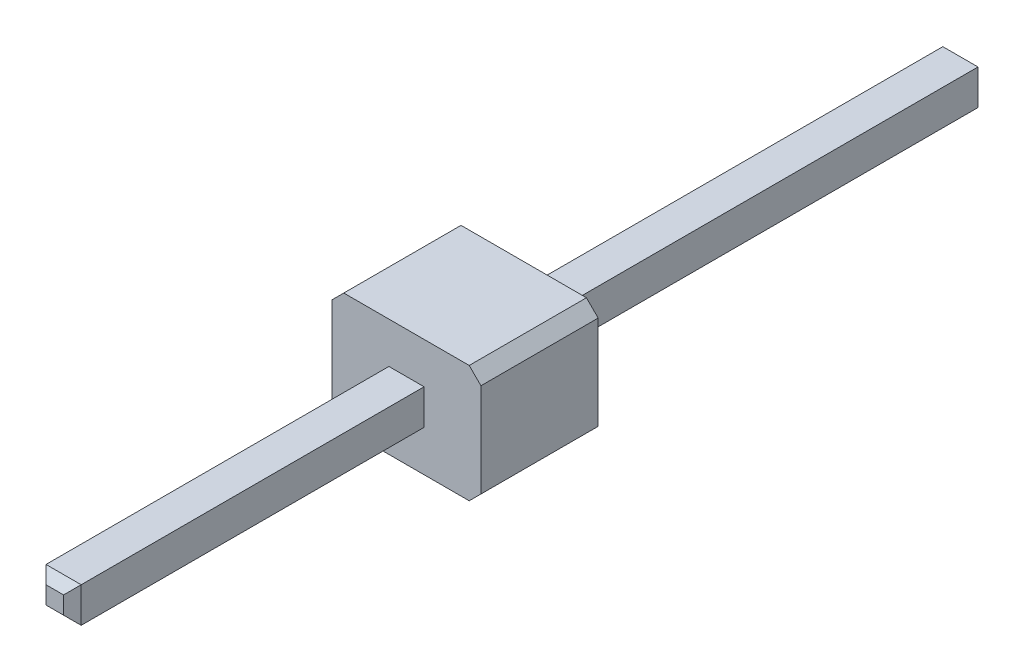
ISO-10303-21;
HEADER;
FILE_DESCRIPTION(('STEP AP214'),'2;1');
FILE_NAME('part.step','',(''),(''),'','','');
FILE_SCHEMA(('AUTOMOTIVE_DESIGN { 1 0 10303 214 1 1 1 1 }'));
ENDSEC;
DATA;
#1=APPLICATION_CONTEXT('core data for automotive mechanical design processes');
#2=APPLICATION_PROTOCOL_DEFINITION('international standard','automotive_design',2000,#1);
#3=PRODUCT_CONTEXT('',#1,'mechanical');
#4=PRODUCT('Part','Part','',(#3));
#5=PRODUCT_RELATED_PRODUCT_CATEGORY('part','',(#4));
#6=PRODUCT_DEFINITION_FORMATION('','',#4);
#7=PRODUCT_DEFINITION_CONTEXT('part definition',#1,'design');
#8=PRODUCT_DEFINITION('design','',#6,#7);
#9=PRODUCT_DEFINITION_SHAPE('','',#8);
#10=(LENGTH_UNIT() NAMED_UNIT(*) SI_UNIT(.MILLI.,.METRE.));
#11=(NAMED_UNIT(*) PLANE_ANGLE_UNIT() SI_UNIT($,.RADIAN.));
#12=(NAMED_UNIT(*) SI_UNIT($,.STERADIAN.) SOLID_ANGLE_UNIT());
#13=UNCERTAINTY_MEASURE_WITH_UNIT(LENGTH_MEASURE(1.E-05),#10,'distance_accuracy_value','');
#14=(GEOMETRIC_REPRESENTATION_CONTEXT(3) GLOBAL_UNCERTAINTY_ASSIGNED_CONTEXT((#13)) GLOBAL_UNIT_ASSIGNED_CONTEXT((#10,
#11,#12)) REPRESENTATION_CONTEXT('',''));
#15=CARTESIAN_POINT('',(0.,0.,0.));
#16=DIRECTION('',(0.,0.,1.));
#17=DIRECTION('',(1.,0.,0.));
#18=AXIS2_PLACEMENT_3D('',#15,#16,#17);
#19=CARTESIAN_POINT('',(-0.15,-0.15,-4.8));
#20=DIRECTION('',(0.,0.,-1.));
#21=DIRECTION('',(1.,0.,0.));
#22=AXIS2_PLACEMENT_3D('',#19,#20,#21);
#23=PLANE('',#22);
#24=DIRECTION('',(0.,1.,0.));
#25=VECTOR('',#24,1.);
#26=CARTESIAN_POINT('',(0.075,-0.15,-4.8));
#27=LINE('',#26,#25);
#28=CARTESIAN_POINT('',(0.075,-0.075,-4.8));
#29=VERTEX_POINT('',#28);
#30=CARTESIAN_POINT('',(0.075,0.075,-4.8));
#31=VERTEX_POINT('',#30);
#32=EDGE_CURVE('E450',#29,#31,#27,.T.);
#33=ORIENTED_EDGE('',*,*,#32,.F.);
#34=DIRECTION('',(1.,0.,0.));
#35=VECTOR('',#34,1.);
#36=CARTESIAN_POINT('',(-0.15,-0.075,-4.8));
#37=LINE('',#36,#35);
#38=CARTESIAN_POINT('',(-0.075,-0.075,-4.8));
#39=VERTEX_POINT('',#38);
#40=EDGE_CURVE('E351',#39,#29,#37,.T.);
#41=ORIENTED_EDGE('',*,*,#40,.F.);
#42=DIRECTION('',(0.,1.,0.));
#43=VECTOR('',#42,1.);
#44=CARTESIAN_POINT('',(-0.075,-0.15,-4.8));
#45=LINE('',#44,#43);
#46=CARTESIAN_POINT('',(-0.075,0.075,-4.8));
#47=VERTEX_POINT('',#46);
#48=EDGE_CURVE('E11',#39,#47,#45,.T.);
#49=ORIENTED_EDGE('',*,*,#48,.T.);
#50=DIRECTION('',(1.,0.,0.));
#51=VECTOR('',#50,1.);
#52=CARTESIAN_POINT('',(-0.15,0.075,-4.8));
#53=LINE('',#52,#51);
#54=EDGE_CURVE('E453',#47,#31,#53,.T.);
#55=ORIENTED_EDGE('',*,*,#54,.T.);
#56=EDGE_LOOP('',(#33,#41,#49,#55));
#57=FACE_BOUND('',#56,.T.);
#58=ADVANCED_FACE('F52',(#57),#23,.T.);
#59=CARTESIAN_POINT('',(-0.15,-0.15,3.));
#60=DIRECTION('',(0.,0.,-1.));
#61=DIRECTION('',(1.,0.,0.));
#62=AXIS2_PLACEMENT_3D('',#59,#60,#61);
#63=PLANE('',#62);
#64=DIRECTION('',(0.,1.,0.));
#65=VECTOR('',#64,1.);
#66=CARTESIAN_POINT('',(0.075,-0.15,3.));
#67=LINE('',#66,#65);
#68=CARTESIAN_POINT('',(0.075,-0.075,3.));
#69=VERTEX_POINT('',#68);
#70=CARTESIAN_POINT('',(0.075,0.075,3.));
#71=VERTEX_POINT('',#70);
#72=EDGE_CURVE('E386',#69,#71,#67,.T.);
#73=ORIENTED_EDGE('',*,*,#72,.T.);
#74=DIRECTION('',(1.,0.,0.));
#75=VECTOR('',#74,1.);
#76=CARTESIAN_POINT('',(-0.15,0.075,3.));
#77=LINE('',#76,#75);
#78=CARTESIAN_POINT('',(-0.075,0.075,3.));
#79=VERTEX_POINT('',#78);
#80=EDGE_CURVE('E333',#79,#71,#77,.T.);
#81=ORIENTED_EDGE('',*,*,#80,.F.);
#82=DIRECTION('',(0.,1.,0.));
#83=VECTOR('',#82,1.);
#84=CARTESIAN_POINT('',(-0.075,-0.15,3.));
#85=LINE('',#84,#83);
#86=CARTESIAN_POINT('',(-0.075,-0.075,3.));
#87=VERTEX_POINT('',#86);
#88=EDGE_CURVE('E383',#87,#79,#85,.T.);
#89=ORIENTED_EDGE('',*,*,#88,.F.);
#90=DIRECTION('',(1.,0.,0.));
#91=VECTOR('',#90,1.);
#92=CARTESIAN_POINT('',(-0.15,-0.075,3.));
#93=LINE('',#92,#91);
#94=EDGE_CURVE('E426',#87,#69,#93,.T.);
#95=ORIENTED_EDGE('',*,*,#94,.T.);
#96=EDGE_LOOP('',(#73,#81,#89,#95));
#97=FACE_BOUND('',#96,.T.);
#98=ADVANCED_FACE('F487',(#97),#63,.F.);
#99=CARTESIAN_POINT('',(-0.1125,-0.15,-4.7625));
#100=DIRECTION('',(0.707106781186548,0.,0.707106781186548));
#101=DIRECTION('',(0.,-1.,0.));
#102=AXIS2_PLACEMENT_3D('',#99,#100,#101);
#103=PLANE('',#102);
#104=ORIENTED_EDGE('',*,*,#48,.F.);
#105=DIRECTION('',(0.577350269189626,0.577350269189626,-0.577350269189626));
#106=VECTOR('',#105,1.);
#107=CARTESIAN_POINT('',(-0.125,-0.125,-4.75));
#108=LINE('',#107,#106);
#109=CARTESIAN_POINT('',(-0.15,-0.15,-4.725));
#110=VERTEX_POINT('',#109);
#111=EDGE_CURVE('E432',#110,#39,#108,.T.);
#112=ORIENTED_EDGE('',*,*,#111,.F.);
#113=DIRECTION('',(0.,1.,0.));
#114=VECTOR('',#113,1.);
#115=CARTESIAN_POINT('',(-0.15,-0.15,-4.725));
#116=LINE('',#115,#114);
#117=CARTESIAN_POINT('',(-0.15,0.15,-4.725));
#118=VERTEX_POINT('',#117);
#119=EDGE_CURVE('E390',#110,#118,#116,.T.);
#120=ORIENTED_EDGE('',*,*,#119,.T.);
#121=DIRECTION('',(0.577350269189626,-0.577350269189626,-0.577350269189626));
#122=VECTOR('',#121,1.);
#123=CARTESIAN_POINT('',(-0.075,0.075,-4.8));
#124=LINE('',#123,#122);
#125=EDGE_CURVE('E55',#118,#47,#124,.T.);
#126=ORIENTED_EDGE('',*,*,#125,.T.);
#127=EDGE_LOOP('',(#104,#112,#120,#126));
#128=FACE_BOUND('',#127,.T.);
#129=ADVANCED_FACE('F492',(#128),#103,.F.);
#130=CARTESIAN_POINT('',(-0.15,0.1125,-4.7625));
#131=DIRECTION('',(0.,0.707106781186548,-0.707106781186548));
#132=DIRECTION('',(1.,0.,0.));
#133=AXIS2_PLACEMENT_3D('',#130,#131,#132);
#134=PLANE('',#133);
#135=ORIENTED_EDGE('',*,*,#54,.F.);
#136=ORIENTED_EDGE('',*,*,#125,.F.);
#137=DIRECTION('',(1.,0.,0.));
#138=VECTOR('',#137,1.);
#139=CARTESIAN_POINT('',(-0.15,0.15,-4.725));
#140=LINE('',#139,#138);
#141=CARTESIAN_POINT('',(0.15,0.15,-4.725));
#142=VERTEX_POINT('',#141);
#143=EDGE_CURVE('E387',#118,#142,#140,.T.);
#144=ORIENTED_EDGE('',*,*,#143,.T.);
#145=DIRECTION('',(-0.577350269189626,-0.577350269189626,-0.577350269189626));
#146=VECTOR('',#145,1.);
#147=CARTESIAN_POINT('',(0.025,0.025,-4.85));
#148=LINE('',#147,#146);
#149=EDGE_CURVE('E80',#142,#31,#148,.T.);
#150=ORIENTED_EDGE('',*,*,#149,.T.);
#151=EDGE_LOOP('',(#135,#136,#144,#150));
#152=FACE_BOUND('',#151,.T.);
#153=ADVANCED_FACE('F729',(#152),#134,.T.);
#154=CARTESIAN_POINT('',(0.1125,-0.15,-4.7625));
#155=DIRECTION('',(0.707106781186548,0.,-0.707106781186548));
#156=DIRECTION('',(0.,-1.,0.));
#157=AXIS2_PLACEMENT_3D('',#154,#155,#156);
#158=PLANE('',#157);
#159=DIRECTION('',(-0.577350269189626,0.577350269189626,-0.577350269189626));
#160=VECTOR('',#159,1.);
#161=CARTESIAN_POINT('',(0.075,-0.075,-4.8));
#162=LINE('',#161,#160);
#163=CARTESIAN_POINT('',(0.15,-0.15,-4.725));
#164=VERTEX_POINT('',#163);
#165=EDGE_CURVE('E355',#164,#29,#162,.T.);
#166=ORIENTED_EDGE('',*,*,#165,.T.);
#167=ORIENTED_EDGE('',*,*,#32,.T.);
#168=ORIENTED_EDGE('',*,*,#149,.F.);
#169=DIRECTION('',(0.,1.,0.));
#170=VECTOR('',#169,1.);
#171=CARTESIAN_POINT('',(0.15,-0.15,-4.725));
#172=LINE('',#171,#170);
#173=EDGE_CURVE('E422',#164,#142,#172,.T.);
#174=ORIENTED_EDGE('',*,*,#173,.F.);
#175=EDGE_LOOP('',(#166,#167,#168,#174));
#176=FACE_BOUND('',#175,.T.);
#177=ADVANCED_FACE('F718',(#176),#158,.T.);
#178=CARTESIAN_POINT('',(-0.15,-0.1125,-4.7625));
#179=DIRECTION('',(0.,0.707106781186548,0.707106781186548));
#180=DIRECTION('',(-1.,0.,0.));
#181=AXIS2_PLACEMENT_3D('',#178,#179,#180);
#182=PLANE('',#181);
#183=ORIENTED_EDGE('',*,*,#111,.T.);
#184=ORIENTED_EDGE('',*,*,#40,.T.);
#185=ORIENTED_EDGE('',*,*,#165,.F.);
#186=DIRECTION('',(1.,0.,0.));
#187=VECTOR('',#186,1.);
#188=CARTESIAN_POINT('',(-0.15,-0.15,-4.725));
#189=LINE('',#188,#187);
#190=EDGE_CURVE('E296',#110,#164,#189,.T.);
#191=ORIENTED_EDGE('',*,*,#190,.F.);
#192=EDGE_LOOP('',(#183,#184,#185,#191));
#193=FACE_BOUND('',#192,.T.);
#194=ADVANCED_FACE('F707',(#193),#182,.F.);
#195=CARTESIAN_POINT('',(-0.1125,-0.15,2.9625));
#196=DIRECTION('',(-0.707106781186548,0.,0.707106781186548));
#197=DIRECTION('',(-0.707106781186548,0.,-0.707106781186548));
#198=AXIS2_PLACEMENT_3D('',#195,#196,#197);
#199=PLANE('',#198);
#200=DIRECTION('',(0.577350269189626,0.577350269189626,0.577350269189626));
#201=VECTOR('',#200,1.);
#202=CARTESIAN_POINT('',(-0.125,-0.125,2.95));
#203=LINE('',#202,#201);
#204=CARTESIAN_POINT('',(-0.15,-0.15,2.925));
#205=VERTEX_POINT('',#204);
#206=EDGE_CURVE('E270',#205,#87,#203,.T.);
#207=ORIENTED_EDGE('',*,*,#206,.T.);
#208=ORIENTED_EDGE('',*,*,#88,.T.);
#209=DIRECTION('',(0.577350269189626,-0.577350269189626,0.577350269189626));
#210=VECTOR('',#209,1.);
#211=CARTESIAN_POINT('',(-0.075,0.075,3.));
#212=LINE('',#211,#210);
#213=CARTESIAN_POINT('',(-0.15,0.15,2.925));
#214=VERTEX_POINT('',#213);
#215=EDGE_CURVE('E330',#214,#79,#212,.T.);
#216=ORIENTED_EDGE('',*,*,#215,.F.);
#217=DIRECTION('',(0.,1.,0.));
#218=VECTOR('',#217,1.);
#219=CARTESIAN_POINT('',(-0.15,-0.15,2.925));
#220=LINE('',#219,#218);
#221=EDGE_CURVE('E301',#205,#214,#220,.T.);
#222=ORIENTED_EDGE('',*,*,#221,.F.);
#223=EDGE_LOOP('',(#207,#208,#216,#222));
#224=FACE_BOUND('',#223,.T.);
#225=ADVANCED_FACE('F522',(#224),#199,.T.);
#226=CARTESIAN_POINT('',(-0.15,0.1125,2.9625));
#227=DIRECTION('',(0.,-0.707106781186548,-0.707106781186548));
#228=DIRECTION('',(-1.,0.,0.));
#229=AXIS2_PLACEMENT_3D('',#226,#227,#228);
#230=PLANE('',#229);
#231=ORIENTED_EDGE('',*,*,#215,.T.);
#232=ORIENTED_EDGE('',*,*,#80,.T.);
#233=DIRECTION('',(-0.577350269189626,-0.577350269189626,0.577350269189626));
#234=VECTOR('',#233,1.);
#235=CARTESIAN_POINT('',(0.025,0.025,3.05));
#236=LINE('',#235,#234);
#237=CARTESIAN_POINT('',(0.15,0.15,2.925));
#238=VERTEX_POINT('',#237);
#239=EDGE_CURVE('E334',#238,#71,#236,.T.);
#240=ORIENTED_EDGE('',*,*,#239,.F.);
#241=DIRECTION('',(1.,0.,0.));
#242=VECTOR('',#241,1.);
#243=CARTESIAN_POINT('',(-0.15,0.15,2.925));
#244=LINE('',#243,#242);
#245=EDGE_CURVE('E400',#214,#238,#244,.T.);
#246=ORIENTED_EDGE('',*,*,#245,.F.);
#247=EDGE_LOOP('',(#231,#232,#240,#246));
#248=FACE_BOUND('',#247,.T.);
#249=ADVANCED_FACE('F516',(#248),#230,.F.);
#250=CARTESIAN_POINT('',(0.1125,-0.15,2.9625));
#251=DIRECTION('',(-0.707106781186548,0.,-0.707106781186548));
#252=DIRECTION('',(0.,1.,0.));
#253=AXIS2_PLACEMENT_3D('',#250,#251,#252);
#254=PLANE('',#253);
#255=ORIENTED_EDGE('',*,*,#72,.F.);
#256=DIRECTION('',(-0.577350269189626,0.577350269189626,0.577350269189626));
#257=VECTOR('',#256,1.);
#258=CARTESIAN_POINT('',(0.075,-0.075,3.));
#259=LINE('',#258,#257);
#260=CARTESIAN_POINT('',(0.15,-0.15,2.925));
#261=VERTEX_POINT('',#260);
#262=EDGE_CURVE('E423',#261,#69,#259,.T.);
#263=ORIENTED_EDGE('',*,*,#262,.F.);
#264=DIRECTION('',(0.,1.,0.));
#265=VECTOR('',#264,1.);
#266=CARTESIAN_POINT('',(0.15,-0.15,2.925));
#267=LINE('',#266,#265);
#268=EDGE_CURVE('E395',#261,#238,#267,.T.);
#269=ORIENTED_EDGE('',*,*,#268,.T.);
#270=ORIENTED_EDGE('',*,*,#239,.T.);
#271=EDGE_LOOP('',(#255,#263,#269,#270));
#272=FACE_BOUND('',#271,.T.);
#273=ADVANCED_FACE('F521',(#272),#254,.F.);
#274=CARTESIAN_POINT('',(-0.15,-0.1125,2.9625));
#275=DIRECTION('',(0.,-0.707106781186548,0.707106781186548));
#276=DIRECTION('',(0.,-0.707106781186548,-0.707106781186548));
#277=AXIS2_PLACEMENT_3D('',#274,#275,#276);
#278=PLANE('',#277);
#279=ORIENTED_EDGE('',*,*,#94,.F.);
#280=ORIENTED_EDGE('',*,*,#206,.F.);
#281=DIRECTION('',(1.,0.,0.));
#282=VECTOR('',#281,1.);
#283=CARTESIAN_POINT('',(-0.15,-0.15,2.925));
#284=LINE('',#283,#282);
#285=EDGE_CURVE('E375',#205,#261,#284,.T.);
#286=ORIENTED_EDGE('',*,*,#285,.T.);
#287=ORIENTED_EDGE('',*,*,#262,.T.);
#288=EDGE_LOOP('',(#279,#280,#286,#287));
#289=FACE_BOUND('',#288,.T.);
#290=ADVANCED_FACE('F678',(#289),#278,.T.);
#291=CARTESIAN_POINT('',(-0.15,-0.15,3.));
#292=DIRECTION('',(1.,0.,0.));
#293=DIRECTION('',(0.,1.,0.));
#294=AXIS2_PLACEMENT_3D('',#291,#292,#293);
#295=PLANE('',#294);
#296=ORIENTED_EDGE('',*,*,#119,.F.);
#297=DIRECTION('',(0.,0.,-1.));
#298=VECTOR('',#297,1.);
#299=CARTESIAN_POINT('',(-0.15,-0.15,3.));
#300=LINE('',#299,#298);
#301=CARTESIAN_POINT('',(-0.15,-0.15,-1.));
#302=VERTEX_POINT('',#301);
#303=EDGE_CURVE('E300',#302,#110,#300,.T.);
#304=ORIENTED_EDGE('',*,*,#303,.F.);
#305=DIRECTION('',(0.,1.,0.));
#306=VECTOR('',#305,1.);
#307=CARTESIAN_POINT('',(-0.15,-0.075,-1.));
#308=LINE('',#307,#306);
#309=CARTESIAN_POINT('',(-0.15,0.15,-1.));
#310=VERTEX_POINT('',#309);
#311=EDGE_CURVE('E318',#302,#310,#308,.T.);
#312=ORIENTED_EDGE('',*,*,#311,.T.);
#313=DIRECTION('',(0.,0.,-1.));
#314=VECTOR('',#313,1.);
#315=CARTESIAN_POINT('',(-0.15,0.15,3.));
#316=LINE('',#315,#314);
#317=EDGE_CURVE('E391',#310,#118,#316,.T.);
#318=ORIENTED_EDGE('',*,*,#317,.T.);
#319=EDGE_LOOP('',(#296,#304,#312,#318));
#320=FACE_BOUND('',#319,.T.);
#321=ADVANCED_FACE('F667',(#320),#295,.F.);
#322=CARTESIAN_POINT('',(-0.15,0.15,3.));
#323=DIRECTION('',(0.,1.,0.));
#324=DIRECTION('',(1.,0.,0.));
#325=AXIS2_PLACEMENT_3D('',#322,#323,#324);
#326=PLANE('',#325);
#327=DIRECTION('',(0.,0.,-1.));
#328=VECTOR('',#327,1.);
#329=CARTESIAN_POINT('',(0.15,0.15,3.));
#330=LINE('',#329,#328);
#331=CARTESIAN_POINT('',(0.15,0.15,-1.));
#332=VERTEX_POINT('',#331);
#333=EDGE_CURVE('E419',#332,#142,#330,.T.);
#334=ORIENTED_EDGE('',*,*,#333,.T.);
#335=ORIENTED_EDGE('',*,*,#143,.F.);
#336=ORIENTED_EDGE('',*,*,#317,.F.);
#337=DIRECTION('',(-1.,0.,0.));
#338=VECTOR('',#337,1.);
#339=CARTESIAN_POINT('',(-0.075,0.15,-1.));
#340=LINE('',#339,#338);
#341=EDGE_CURVE('E322',#332,#310,#340,.T.);
#342=ORIENTED_EDGE('',*,*,#341,.F.);
#343=EDGE_LOOP('',(#334,#335,#336,#342));
#344=FACE_BOUND('',#343,.T.);
#345=ADVANCED_FACE('F583',(#344),#326,.T.);
#346=CARTESIAN_POINT('',(0.15,-0.15,3.));
#347=DIRECTION('',(1.,0.,0.));
#348=DIRECTION('',(0.,1.,0.));
#349=AXIS2_PLACEMENT_3D('',#346,#347,#348);
#350=PLANE('',#349);
#351=DIRECTION('',(0.,0.,-1.));
#352=VECTOR('',#351,1.);
#353=CARTESIAN_POINT('',(0.15,-0.15,3.));
#354=LINE('',#353,#352);
#355=CARTESIAN_POINT('',(0.15,-0.15,-1.));
#356=VERTEX_POINT('',#355);
#357=EDGE_CURVE('E416',#356,#164,#354,.T.);
#358=ORIENTED_EDGE('',*,*,#357,.T.);
#359=ORIENTED_EDGE('',*,*,#173,.T.);
#360=ORIENTED_EDGE('',*,*,#333,.F.);
#361=DIRECTION('',(0.,1.,0.));
#362=VECTOR('',#361,1.);
#363=CARTESIAN_POINT('',(0.15,-0.075,-1.));
#364=LINE('',#363,#362);
#365=EDGE_CURVE('E350',#356,#332,#364,.T.);
#366=ORIENTED_EDGE('',*,*,#365,.F.);
#367=EDGE_LOOP('',(#358,#359,#360,#366));
#368=FACE_BOUND('',#367,.T.);
#369=ADVANCED_FACE('F468',(#368),#350,.T.);
#370=CARTESIAN_POINT('',(-0.15,-0.15,3.));
#371=DIRECTION('',(0.,1.,0.));
#372=DIRECTION('',(1.,0.,0.));
#373=AXIS2_PLACEMENT_3D('',#370,#371,#372);
#374=PLANE('',#373);
#375=ORIENTED_EDGE('',*,*,#190,.T.);
#376=ORIENTED_EDGE('',*,*,#357,.F.);
#377=DIRECTION('',(-1.,0.,0.));
#378=VECTOR('',#377,1.);
#379=CARTESIAN_POINT('',(-0.075,-0.15,-1.));
#380=LINE('',#379,#378);
#381=EDGE_CURVE('E323',#356,#302,#380,.T.);
#382=ORIENTED_EDGE('',*,*,#381,.T.);
#383=ORIENTED_EDGE('',*,*,#303,.T.);
#384=EDGE_LOOP('',(#375,#376,#382,#383));
#385=FACE_BOUND('',#384,.T.);
#386=ADVANCED_FACE('F461',(#385),#374,.F.);
#387=CARTESIAN_POINT('',(-0.15,-0.15,3.));
#388=DIRECTION('',(1.,0.,0.));
#389=DIRECTION('',(0.,1.,0.));
#390=AXIS2_PLACEMENT_3D('',#387,#388,#389);
#391=PLANE('',#390);
#392=DIRECTION('',(0.,1.,0.));
#393=VECTOR('',#392,1.);
#394=CARTESIAN_POINT('',(-0.15,-0.075,0.));
#395=LINE('',#394,#393);
#396=CARTESIAN_POINT('',(-0.15,-0.15,0.));
#397=VERTEX_POINT('',#396);
#398=CARTESIAN_POINT('',(-0.15,0.15,0.));
#399=VERTEX_POINT('',#398);
#400=EDGE_CURVE('E310',#397,#399,#395,.T.);
#401=ORIENTED_EDGE('',*,*,#400,.F.);
#402=DIRECTION('',(0.,0.,-1.));
#403=VECTOR('',#402,1.);
#404=CARTESIAN_POINT('',(-0.15,-0.15,3.));
#405=LINE('',#404,#403);
#406=EDGE_CURVE('E371',#205,#397,#405,.T.);
#407=ORIENTED_EDGE('',*,*,#406,.F.);
#408=ORIENTED_EDGE('',*,*,#221,.T.);
#409=DIRECTION('',(0.,0.,-1.));
#410=VECTOR('',#409,1.);
#411=CARTESIAN_POINT('',(-0.15,0.15,3.));
#412=LINE('',#411,#410);
#413=EDGE_CURVE('E407',#214,#399,#412,.T.);
#414=ORIENTED_EDGE('',*,*,#413,.T.);
#415=EDGE_LOOP('',(#401,#407,#408,#414));
#416=FACE_BOUND('',#415,.T.);
#417=ADVANCED_FACE('F467',(#416),#391,.F.);
#418=CARTESIAN_POINT('',(-0.15,0.15,3.));
#419=DIRECTION('',(0.,1.,0.));
#420=DIRECTION('',(1.,0.,0.));
#421=AXIS2_PLACEMENT_3D('',#418,#419,#420);
#422=PLANE('',#421);
#423=DIRECTION('',(0.,0.,-1.));
#424=VECTOR('',#423,1.);
#425=CARTESIAN_POINT('',(0.15,0.15,3.));
#426=LINE('',#425,#424);
#427=CARTESIAN_POINT('',(0.15,0.15,0.));
#428=VERTEX_POINT('',#427);
#429=EDGE_CURVE('E396',#238,#428,#426,.T.);
#430=ORIENTED_EDGE('',*,*,#429,.T.);
#431=DIRECTION('',(-1.,0.,0.));
#432=VECTOR('',#431,1.);
#433=CARTESIAN_POINT('',(-0.075,0.15,0.));
#434=LINE('',#433,#432);
#435=EDGE_CURVE('E304',#428,#399,#434,.T.);
#436=ORIENTED_EDGE('',*,*,#435,.T.);
#437=ORIENTED_EDGE('',*,*,#413,.F.);
#438=ORIENTED_EDGE('',*,*,#245,.T.);
#439=EDGE_LOOP('',(#430,#436,#437,#438));
#440=FACE_BOUND('',#439,.T.);
#441=ADVANCED_FACE('F608',(#440),#422,.T.);
#442=CARTESIAN_POINT('',(0.15,-0.15,3.));
#443=DIRECTION('',(1.,0.,0.));
#444=DIRECTION('',(0.,1.,0.));
#445=AXIS2_PLACEMENT_3D('',#442,#443,#444);
#446=PLANE('',#445);
#447=DIRECTION('',(0.,0.,-1.));
#448=VECTOR('',#447,1.);
#449=CARTESIAN_POINT('',(0.15,-0.15,3.));
#450=LINE('',#449,#448);
#451=CARTESIAN_POINT('',(0.15,-0.15,0.));
#452=VERTEX_POINT('',#451);
#453=EDGE_CURVE('E379',#261,#452,#450,.T.);
#454=ORIENTED_EDGE('',*,*,#453,.T.);
#455=DIRECTION('',(0.,1.,0.));
#456=VECTOR('',#455,1.);
#457=CARTESIAN_POINT('',(0.15,-0.075,0.));
#458=LINE('',#457,#456);
#459=EDGE_CURVE('E279',#452,#428,#458,.T.);
#460=ORIENTED_EDGE('',*,*,#459,.T.);
#461=ORIENTED_EDGE('',*,*,#429,.F.);
#462=ORIENTED_EDGE('',*,*,#268,.F.);
#463=EDGE_LOOP('',(#454,#460,#461,#462));
#464=FACE_BOUND('',#463,.T.);
#465=ADVANCED_FACE('F602',(#464),#446,.T.);
#466=CARTESIAN_POINT('',(-0.15,-0.15,3.));
#467=DIRECTION('',(0.,1.,0.));
#468=DIRECTION('',(1.,0.,0.));
#469=AXIS2_PLACEMENT_3D('',#466,#467,#468);
#470=PLANE('',#469);
#471=DIRECTION('',(-1.,0.,0.));
#472=VECTOR('',#471,1.);
#473=CARTESIAN_POINT('',(-0.075,-0.15,0.));
#474=LINE('',#473,#472);
#475=EDGE_CURVE('E314',#452,#397,#474,.T.);
#476=ORIENTED_EDGE('',*,*,#475,.F.);
#477=ORIENTED_EDGE('',*,*,#453,.F.);
#478=ORIENTED_EDGE('',*,*,#285,.F.);
#479=ORIENTED_EDGE('',*,*,#406,.T.);
#480=EDGE_LOOP('',(#476,#477,#478,#479));
#481=FACE_BOUND('',#480,.T.);
#482=ADVANCED_FACE('F607',(#481),#470,.F.);
#483=CARTESIAN_POINT('',(0.535,-0.5,0.));
#484=DIRECTION('',(-0.707106781186548,0.707106781186548,0.));
#485=DIRECTION('',(0.,0.,-1.));
#486=AXIS2_PLACEMENT_3D('',#483,#484,#485);
#487=PLANE('',#486);
#488=DIRECTION('',(0.707106781186548,0.707106781186548,0.));
#489=VECTOR('',#488,1.);
#490=CARTESIAN_POINT('',(0.535,-0.5,0.));
#491=LINE('',#490,#489);
#492=CARTESIAN_POINT('',(0.535,-0.5,0.));
#493=VERTEX_POINT('',#492);
#494=CARTESIAN_POINT('',(0.635,-0.4,0.));
#495=VERTEX_POINT('',#494);
#496=EDGE_CURVE('E287',#493,#495,#491,.T.);
#497=ORIENTED_EDGE('',*,*,#496,.F.);
#498=DIRECTION('',(0.,0.,-1.));
#499=VECTOR('',#498,1.);
#500=CARTESIAN_POINT('',(0.535,-0.5,0.));
#501=LINE('',#500,#499);
#502=CARTESIAN_POINT('',(0.535,-0.5,-1.));
#503=VERTEX_POINT('',#502);
#504=EDGE_CURVE('E367',#493,#503,#501,.T.);
#505=ORIENTED_EDGE('',*,*,#504,.T.);
#506=DIRECTION('',(0.707106781186548,0.707106781186548,0.));
#507=VECTOR('',#506,1.);
#508=CARTESIAN_POINT('',(0.535,-0.5,-1.));
#509=LINE('',#508,#507);
#510=CARTESIAN_POINT('',(0.635,-0.4,-1.));
#511=VERTEX_POINT('',#510);
#512=EDGE_CURVE('E329',#503,#511,#509,.T.);
#513=ORIENTED_EDGE('',*,*,#512,.T.);
#514=DIRECTION('',(0.,0.,-1.));
#515=VECTOR('',#514,1.);
#516=CARTESIAN_POINT('',(0.635,-0.4,0.));
#517=LINE('',#516,#515);
#518=EDGE_CURVE('E363',#495,#511,#517,.T.);
#519=ORIENTED_EDGE('',*,*,#518,.F.);
#520=EDGE_LOOP('',(#497,#505,#513,#519));
#521=FACE_BOUND('',#520,.T.);
#522=ADVANCED_FACE('F620',(#521),#487,.F.);
#523=CARTESIAN_POINT('',(-0.535,-0.5,0.));
#524=DIRECTION('',(0.,1.,0.));
#525=DIRECTION('',(1.,0.,0.));
#526=AXIS2_PLACEMENT_3D('',#523,#524,#525);
#527=PLANE('',#526);
#528=DIRECTION('',(1.,0.,0.));
#529=VECTOR('',#528,1.);
#530=CARTESIAN_POINT('',(-0.535,-0.5,0.));
#531=LINE('',#530,#529);
#532=CARTESIAN_POINT('',(-0.535,-0.5,0.));
#533=VERTEX_POINT('',#532);
#534=EDGE_CURVE('E280',#533,#493,#531,.T.);
#535=ORIENTED_EDGE('',*,*,#534,.F.);
#536=DIRECTION('',(0.,0.,-1.));
#537=VECTOR('',#536,1.);
#538=CARTESIAN_POINT('',(-0.535,-0.5,0.));
#539=LINE('',#538,#537);
#540=CARTESIAN_POINT('',(-0.535,-0.5,-1.));
#541=VERTEX_POINT('',#540);
#542=EDGE_CURVE('E362',#533,#541,#539,.T.);
#543=ORIENTED_EDGE('',*,*,#542,.T.);
#544=DIRECTION('',(1.,0.,0.));
#545=VECTOR('',#544,1.);
#546=CARTESIAN_POINT('',(-0.535,-0.5,-1.));
#547=LINE('',#546,#545);
#548=EDGE_CURVE('E326',#541,#503,#547,.T.);
#549=ORIENTED_EDGE('',*,*,#548,.T.);
#550=ORIENTED_EDGE('',*,*,#504,.F.);
#551=EDGE_LOOP('',(#535,#543,#549,#550));
#552=FACE_BOUND('',#551,.T.);
#553=ADVANCED_FACE('F594',(#552),#527,.F.);
#554=CARTESIAN_POINT('',(0.635,-0.4,0.));
#555=DIRECTION('',(-1.,0.,0.));
#556=DIRECTION('',(0.,0.,-1.));
#557=AXIS2_PLACEMENT_3D('',#554,#555,#556);
#558=PLANE('',#557);
#559=DIRECTION('',(0.,1.,0.));
#560=VECTOR('',#559,1.);
#561=CARTESIAN_POINT('',(0.635,-0.4,0.));
#562=LINE('',#561,#560);
#563=CARTESIAN_POINT('',(0.635,0.4,0.));
#564=VERTEX_POINT('',#563);
#565=EDGE_CURVE('E284',#495,#564,#562,.T.);
#566=ORIENTED_EDGE('',*,*,#565,.F.);
#567=ORIENTED_EDGE('',*,*,#518,.T.);
#568=DIRECTION('',(0.,1.,0.));
#569=VECTOR('',#568,1.);
#570=CARTESIAN_POINT('',(0.635,-0.4,-1.));
#571=LINE('',#570,#569);
#572=CARTESIAN_POINT('',(0.635,0.4,-1.));
#573=VERTEX_POINT('',#572);
#574=EDGE_CURVE('E338',#511,#573,#571,.T.);
#575=ORIENTED_EDGE('',*,*,#574,.T.);
#576=DIRECTION('',(0.,0.,-1.));
#577=VECTOR('',#576,1.);
#578=CARTESIAN_POINT('',(0.635,0.4,0.));
#579=LINE('',#578,#577);
#580=EDGE_CURVE('E358',#564,#573,#579,.T.);
#581=ORIENTED_EDGE('',*,*,#580,.F.);
#582=EDGE_LOOP('',(#566,#567,#575,#581));
#583=FACE_BOUND('',#582,.T.);
#584=ADVANCED_FACE('F507',(#583),#558,.F.);
#585=CARTESIAN_POINT('',(-0.635,-0.4,0.));
#586=DIRECTION('',(0.707106781186548,0.707106781186548,0.));
#587=DIRECTION('',(0.,0.,1.));
#588=AXIS2_PLACEMENT_3D('',#585,#586,#587);
#589=PLANE('',#588);
#590=DIRECTION('',(0.707106781186548,-0.707106781186548,0.));
#591=VECTOR('',#590,1.);
#592=CARTESIAN_POINT('',(-0.635,-0.4,0.));
#593=LINE('',#592,#591);
#594=CARTESIAN_POINT('',(-0.635,-0.4,0.));
#595=VERTEX_POINT('',#594);
#596=EDGE_CURVE('E276',#595,#533,#593,.T.);
#597=ORIENTED_EDGE('',*,*,#596,.F.);
#598=DIRECTION('',(0.,0.,-1.));
#599=VECTOR('',#598,1.);
#600=CARTESIAN_POINT('',(-0.635,-0.4,0.));
#601=LINE('',#600,#599);
#602=CARTESIAN_POINT('',(-0.635,-0.4,-1.));
#603=VERTEX_POINT('',#602);
#604=EDGE_CURVE('E283',#595,#603,#601,.T.);
#605=ORIENTED_EDGE('',*,*,#604,.T.);
#606=DIRECTION('',(0.707106781186548,-0.707106781186548,0.));
#607=VECTOR('',#606,1.);
#608=CARTESIAN_POINT('',(-0.635,-0.4,-1.));
#609=LINE('',#608,#607);
#610=EDGE_CURVE('E317',#603,#541,#609,.T.);
#611=ORIENTED_EDGE('',*,*,#610,.T.);
#612=ORIENTED_EDGE('',*,*,#542,.F.);
#613=EDGE_LOOP('',(#597,#605,#611,#612));
#614=FACE_BOUND('',#613,.T.);
#615=ADVANCED_FACE('F501',(#614),#589,.F.);
#616=CARTESIAN_POINT('',(0.635,0.4,0.));
#617=DIRECTION('',(-0.707106781186548,-0.707106781186548,0.));
#618=DIRECTION('',(-0.707106781186548,0.707106781186548,0.));
#619=AXIS2_PLACEMENT_3D('',#616,#617,#618);
#620=PLANE('',#619);
#621=DIRECTION('',(-0.707106781186548,0.707106781186548,0.));
#622=VECTOR('',#621,1.);
#623=CARTESIAN_POINT('',(0.635,0.4,0.));
#624=LINE('',#623,#622);
#625=CARTESIAN_POINT('',(0.535,0.5,0.));
#626=VERTEX_POINT('',#625);
#627=EDGE_CURVE('E261',#564,#626,#624,.T.);
#628=ORIENTED_EDGE('',*,*,#627,.F.);
#629=ORIENTED_EDGE('',*,*,#580,.T.);
#630=DIRECTION('',(-0.707106781186548,0.707106781186548,0.));
#631=VECTOR('',#630,1.);
#632=CARTESIAN_POINT('',(0.635,0.4,-1.));
#633=LINE('',#632,#631);
#634=CARTESIAN_POINT('',(0.535,0.5,-1.));
#635=VERTEX_POINT('',#634);
#636=EDGE_CURVE('E341',#573,#635,#633,.T.);
#637=ORIENTED_EDGE('',*,*,#636,.T.);
#638=DIRECTION('',(0.,0.,-1.));
#639=VECTOR('',#638,1.);
#640=CARTESIAN_POINT('',(0.535,0.5,0.));
#641=LINE('',#640,#639);
#642=EDGE_CURVE('E267',#626,#635,#641,.T.);
#643=ORIENTED_EDGE('',*,*,#642,.F.);
#644=EDGE_LOOP('',(#628,#629,#637,#643));
#645=FACE_BOUND('',#644,.T.);
#646=ADVANCED_FACE('F506',(#645),#620,.F.);
#647=CARTESIAN_POINT('',(0.,0.,-1.));
#648=DIRECTION('',(0.,0.,-1.));
#649=DIRECTION('',(1.,0.,0.));
#650=AXIS2_PLACEMENT_3D('',#647,#648,#649);
#651=PLANE('',#650);
#652=ORIENTED_EDGE('',*,*,#381,.F.);
#653=ORIENTED_EDGE('',*,*,#365,.T.);
#654=ORIENTED_EDGE('',*,*,#341,.T.);
#655=ORIENTED_EDGE('',*,*,#311,.F.);
#656=EDGE_LOOP('',(#652,#653,#654,#655));
#657=FACE_BOUND('',#656,.T.);
#658=DIRECTION('',(-0.707106781186548,-0.707106781186548,0.));
#659=VECTOR('',#658,1.);
#660=CARTESIAN_POINT('',(-0.535,0.5,-1.));
#661=LINE('',#660,#659);
#662=CARTESIAN_POINT('',(-0.535,0.5,-1.));
#663=VERTEX_POINT('',#662);
#664=CARTESIAN_POINT('',(-0.635,0.4,-1.));
#665=VERTEX_POINT('',#664);
#666=EDGE_CURVE('E248',#663,#665,#661,.T.);
#667=ORIENTED_EDGE('',*,*,#666,.F.);
#668=DIRECTION('',(-1.,0.,0.));
#669=VECTOR('',#668,1.);
#670=CARTESIAN_POINT('',(0.535,0.5,-1.));
#671=LINE('',#670,#669);
#672=EDGE_CURVE('E243',#635,#663,#671,.T.);
#673=ORIENTED_EDGE('',*,*,#672,.F.);
#674=ORIENTED_EDGE('',*,*,#636,.F.);
#675=ORIENTED_EDGE('',*,*,#574,.F.);
#676=ORIENTED_EDGE('',*,*,#512,.F.);
#677=ORIENTED_EDGE('',*,*,#548,.F.);
#678=ORIENTED_EDGE('',*,*,#610,.F.);
#679=DIRECTION('',(0.,-1.,0.));
#680=VECTOR('',#679,1.);
#681=CARTESIAN_POINT('',(-0.635,0.4,-1.));
#682=LINE('',#681,#680);
#683=EDGE_CURVE('E291',#665,#603,#682,.T.);
#684=ORIENTED_EDGE('',*,*,#683,.F.);
#685=EDGE_LOOP('',(#667,#673,#674,#675,#676,#677,#678,#684));
#686=FACE_BOUND('',#685,.T.);
#687=ADVANCED_FACE('F554',(#657,#686),#651,.T.);
#688=CARTESIAN_POINT('',(0.,0.,0.));
#689=DIRECTION('',(0.,0.,-1.));
#690=DIRECTION('',(1.,0.,0.));
#691=AXIS2_PLACEMENT_3D('',#688,#689,#690);
#692=PLANE('',#691);
#693=ORIENTED_EDGE('',*,*,#459,.F.);
#694=ORIENTED_EDGE('',*,*,#475,.T.);
#695=ORIENTED_EDGE('',*,*,#400,.T.);
#696=ORIENTED_EDGE('',*,*,#435,.F.);
#697=EDGE_LOOP('',(#693,#694,#695,#696));
#698=FACE_BOUND('',#697,.T.);
#699=DIRECTION('',(-1.,0.,0.));
#700=VECTOR('',#699,1.);
#701=CARTESIAN_POINT('',(0.535,0.5,0.));
#702=LINE('',#701,#700);
#703=CARTESIAN_POINT('',(-0.535,0.5,0.));
#704=VERTEX_POINT('',#703);
#705=EDGE_CURVE('E241',#626,#704,#702,.T.);
#706=ORIENTED_EDGE('',*,*,#705,.T.);
#707=DIRECTION('',(-0.707106781186548,-0.707106781186548,0.));
#708=VECTOR('',#707,1.);
#709=CARTESIAN_POINT('',(-0.535,0.5,0.));
#710=LINE('',#709,#708);
#711=CARTESIAN_POINT('',(-0.635,0.4,0.));
#712=VERTEX_POINT('',#711);
#713=EDGE_CURVE('E251',#704,#712,#710,.T.);
#714=ORIENTED_EDGE('',*,*,#713,.T.);
#715=DIRECTION('',(0.,-1.,0.));
#716=VECTOR('',#715,1.);
#717=CARTESIAN_POINT('',(-0.635,0.4,0.));
#718=LINE('',#717,#716);
#719=EDGE_CURVE('E275',#712,#595,#718,.T.);
#720=ORIENTED_EDGE('',*,*,#719,.T.);
#721=ORIENTED_EDGE('',*,*,#596,.T.);
#722=ORIENTED_EDGE('',*,*,#534,.T.);
#723=ORIENTED_EDGE('',*,*,#496,.T.);
#724=ORIENTED_EDGE('',*,*,#565,.T.);
#725=ORIENTED_EDGE('',*,*,#627,.T.);
#726=EDGE_LOOP('',(#706,#714,#720,#721,#722,#723,#724,#725));
#727=FACE_BOUND('',#726,.T.);
#728=ADVANCED_FACE('F259',(#698,#727),#692,.F.);
#729=CARTESIAN_POINT('',(-0.635,0.4,0.));
#730=DIRECTION('',(1.,0.,0.));
#731=DIRECTION('',(0.,1.,0.));
#732=AXIS2_PLACEMENT_3D('',#729,#730,#731);
#733=PLANE('',#732);
#734=ORIENTED_EDGE('',*,*,#719,.F.);
#735=DIRECTION('',(0.,0.,-1.));
#736=VECTOR('',#735,1.);
#737=CARTESIAN_POINT('',(-0.635,0.4,0.));
#738=LINE('',#737,#736);
#739=EDGE_CURVE('E253',#712,#665,#738,.T.);
#740=ORIENTED_EDGE('',*,*,#739,.T.);
#741=ORIENTED_EDGE('',*,*,#683,.T.);
#742=ORIENTED_EDGE('',*,*,#604,.F.);
#743=EDGE_LOOP('',(#734,#740,#741,#742));
#744=FACE_BOUND('',#743,.T.);
#745=ADVANCED_FACE('F534',(#744),#733,.F.);
#746=CARTESIAN_POINT('',(0.535,0.5,0.));
#747=DIRECTION('',(0.,-1.,0.));
#748=DIRECTION('',(0.,0.,1.));
#749=AXIS2_PLACEMENT_3D('',#746,#747,#748);
#750=PLANE('',#749);
#751=ORIENTED_EDGE('',*,*,#705,.F.);
#752=ORIENTED_EDGE('',*,*,#642,.T.);
#753=ORIENTED_EDGE('',*,*,#672,.T.);
#754=DIRECTION('',(0.,0.,-1.));
#755=VECTOR('',#754,1.);
#756=CARTESIAN_POINT('',(-0.535,0.5,0.));
#757=LINE('',#756,#755);
#758=EDGE_CURVE('E236',#704,#663,#757,.T.);
#759=ORIENTED_EDGE('',*,*,#758,.F.);
#760=EDGE_LOOP('',(#751,#752,#753,#759));
#761=FACE_BOUND('',#760,.T.);
#762=ADVANCED_FACE('F238',(#761),#750,.F.);
#763=CARTESIAN_POINT('',(-0.535,0.5,0.));
#764=DIRECTION('',(0.707106781186548,-0.707106781186548,0.));
#765=DIRECTION('',(0.,0.,1.));
#766=AXIS2_PLACEMENT_3D('',#763,#764,#765);
#767=PLANE('',#766);
#768=ORIENTED_EDGE('',*,*,#713,.F.);
#769=ORIENTED_EDGE('',*,*,#758,.T.);
#770=ORIENTED_EDGE('',*,*,#666,.T.);
#771=ORIENTED_EDGE('',*,*,#739,.F.);
#772=EDGE_LOOP('',(#768,#769,#770,#771));
#773=FACE_BOUND('',#772,.T.);
#774=ADVANCED_FACE('F252',(#773),#767,.F.);
#775=CLOSED_SHELL('',(#58,#98,#129,#153,#177,#194,#225,#249,#273,#290,#321,#345,#369,#386,#417,
#441,#465,#482,#522,#553,#584,#615,#646,#687,#728,#745,#762,#774));
#776=MANIFOLD_SOLID_BREP('B2',#775);
#777=ADVANCED_BREP_SHAPE_REPRESENTATION('',(#18,#776),#14);
#778=SHAPE_DEFINITION_REPRESENTATION(#9,#777);
ENDSEC;
END-ISO-10303-21;
